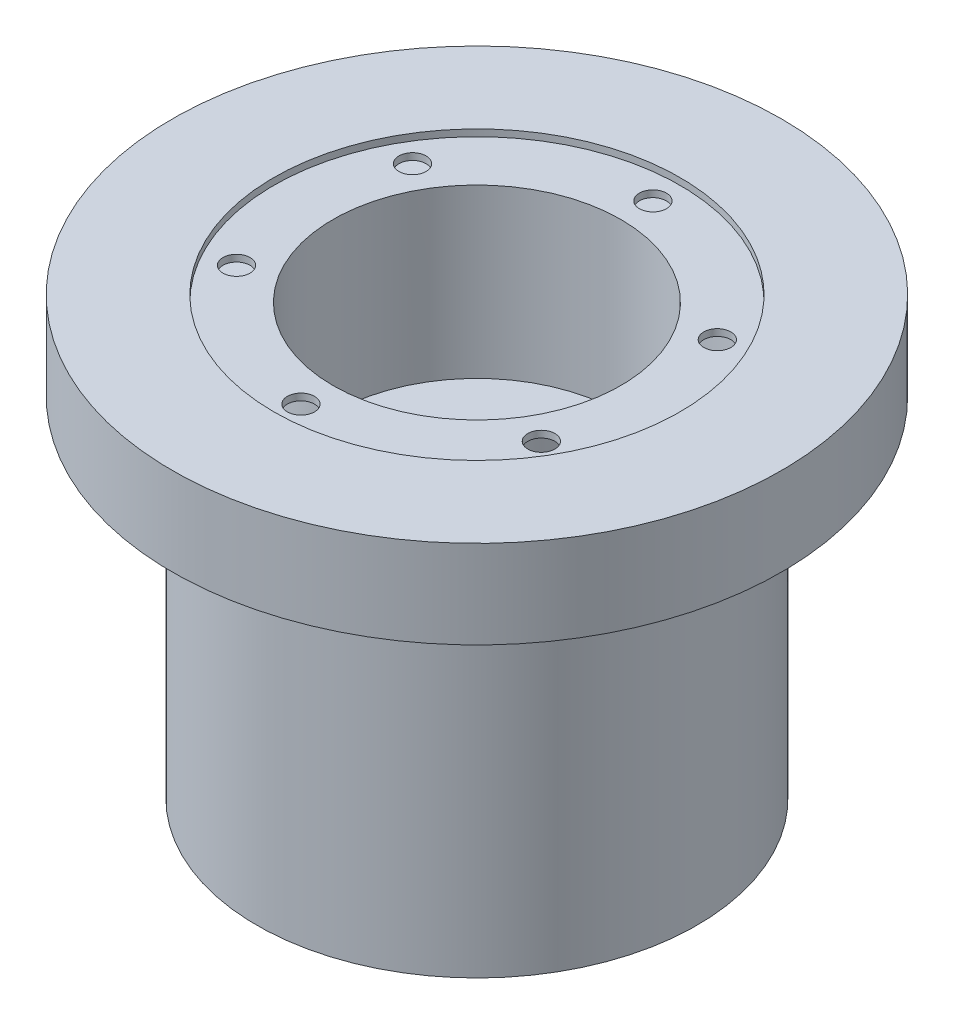
ISO-10303-21;
HEADER;
FILE_DESCRIPTION(('STEP AP214'),'2;1');
FILE_NAME('part.step','',(''),(''),'','','');
FILE_SCHEMA(('AUTOMOTIVE_DESIGN { 1 0 10303 214 1 1 1 1 }'));
ENDSEC;
DATA;
#1=APPLICATION_CONTEXT('core data for automotive mechanical design processes');
#2=APPLICATION_PROTOCOL_DEFINITION('international standard','automotive_design',2000,#1);
#3=PRODUCT_CONTEXT('',#1,'mechanical');
#4=PRODUCT('Part','Part','',(#3));
#5=PRODUCT_RELATED_PRODUCT_CATEGORY('part','',(#4));
#6=PRODUCT_DEFINITION_FORMATION('','',#4);
#7=PRODUCT_DEFINITION_CONTEXT('part definition',#1,'design');
#8=PRODUCT_DEFINITION('design','',#6,#7);
#9=PRODUCT_DEFINITION_SHAPE('','',#8);
#10=(LENGTH_UNIT() NAMED_UNIT(*) SI_UNIT(.MILLI.,.METRE.));
#11=(NAMED_UNIT(*) PLANE_ANGLE_UNIT() SI_UNIT($,.RADIAN.));
#12=(NAMED_UNIT(*) SI_UNIT($,.STERADIAN.) SOLID_ANGLE_UNIT());
#13=UNCERTAINTY_MEASURE_WITH_UNIT(LENGTH_MEASURE(1.E-05),#10,'distance_accuracy_value','');
#14=(GEOMETRIC_REPRESENTATION_CONTEXT(3) GLOBAL_UNCERTAINTY_ASSIGNED_CONTEXT((#13)) GLOBAL_UNIT_ASSIGNED_CONTEXT((#10,
#11,#12)) REPRESENTATION_CONTEXT('',''));
#15=CARTESIAN_POINT('',(0.,0.,0.));
#16=DIRECTION('',(0.,0.,1.));
#17=DIRECTION('',(1.,0.,0.));
#18=AXIS2_PLACEMENT_3D('',#15,#16,#17);
#19=CARTESIAN_POINT('',(0.,23.8395232070911,0.));
#20=DIRECTION('',(0.,1.,0.));
#21=DIRECTION('',(0.,0.,1.));
#22=AXIS2_PLACEMENT_3D('',#19,#20,#21);
#23=PLANE('',#22);
#24=CARTESIAN_POINT('',(14.769356871362,23.8395232070911,-26.));
#25=DIRECTION('',(0.,1.,0.));
#26=DIRECTION('',(0.,0.,1.));
#27=AXIS2_PLACEMENT_3D('',#24,#25,#26);
#28=CIRCLE('',#27,2.);
#29=CARTESIAN_POINT('',(14.769356871362,23.8395232070911,-24.));
#30=VERTEX_POINT('',#29);
#31=EDGE_CURVE('E37',#30,#30,#28,.T.);
#32=ORIENTED_EDGE('',*,*,#31,.T.);
#33=EDGE_LOOP('',(#32));
#34=FACE_BOUND('',#33,.T.);
#35=CARTESIAN_POINT('',(37.2860173697574,23.8395232070911,-13.));
#36=DIRECTION('',(0.,1.,0.));
#37=DIRECTION('',(0.,0.,1.));
#38=AXIS2_PLACEMENT_3D('',#35,#36,#37);
#39=CIRCLE('',#38,2.00000000000002);
#40=CARTESIAN_POINT('',(37.2860173697574,23.8395232070911,-11.));
#41=VERTEX_POINT('',#40);
#42=EDGE_CURVE('E70',#41,#41,#39,.T.);
#43=ORIENTED_EDGE('',*,*,#42,.T.);
#44=EDGE_LOOP('',(#43));
#45=FACE_BOUND('',#44,.T.);
#46=CARTESIAN_POINT('',(37.2860173697574,23.8395232070911,13.));
#47=DIRECTION('',(0.,1.,0.));
#48=DIRECTION('',(0.,0.,1.));
#49=AXIS2_PLACEMENT_3D('',#46,#47,#48);
#50=CIRCLE('',#49,2.);
#51=CARTESIAN_POINT('',(37.2860173697574,23.8395232070911,15.));
#52=VERTEX_POINT('',#51);
#53=EDGE_CURVE('E67',#52,#52,#50,.T.);
#54=ORIENTED_EDGE('',*,*,#53,.T.);
#55=EDGE_LOOP('',(#54));
#56=FACE_BOUND('',#55,.T.);
#57=CARTESIAN_POINT('',(14.769356871362,23.8395232070911,26.));
#58=DIRECTION('',(0.,1.,0.));
#59=DIRECTION('',(0.,0.,1.));
#60=AXIS2_PLACEMENT_3D('',#57,#58,#59);
#61=CIRCLE('',#60,2.00000000000001);
#62=CARTESIAN_POINT('',(14.769356871362,23.8395232070911,28.));
#63=VERTEX_POINT('',#62);
#64=EDGE_CURVE('E63',#63,#63,#61,.T.);
#65=ORIENTED_EDGE('',*,*,#64,.T.);
#66=EDGE_LOOP('',(#65));
#67=FACE_BOUND('',#66,.T.);
#68=CARTESIAN_POINT('',(-7.74730362703343,23.8395232070911,13.));
#69=DIRECTION('',(0.,1.,0.));
#70=DIRECTION('',(0.,0.,1.));
#71=AXIS2_PLACEMENT_3D('',#68,#69,#70);
#72=CIRCLE('',#71,2.);
#73=CARTESIAN_POINT('',(-7.74730362703343,23.8395232070911,15.));
#74=VERTEX_POINT('',#73);
#75=EDGE_CURVE('E59',#74,#74,#72,.T.);
#76=ORIENTED_EDGE('',*,*,#75,.T.);
#77=EDGE_LOOP('',(#76));
#78=FACE_BOUND('',#77,.T.);
#79=CARTESIAN_POINT('',(-7.74730362703344,23.8395232070911,-13.));
#80=DIRECTION('',(0.,1.,0.));
#81=DIRECTION('',(0.,0.,1.));
#82=AXIS2_PLACEMENT_3D('',#79,#80,#81);
#83=CIRCLE('',#82,2.00000000000001);
#84=CARTESIAN_POINT('',(-7.74730362703344,23.8395232070911,-11.));
#85=VERTEX_POINT('',#84);
#86=EDGE_CURVE('E55',#85,#85,#83,.T.);
#87=ORIENTED_EDGE('',*,*,#86,.T.);
#88=EDGE_LOOP('',(#87));
#89=FACE_BOUND('',#88,.T.);
#90=CARTESIAN_POINT('',(14.769356871362,23.8395232070911,0.));
#91=DIRECTION('',(0.,-1.,0.));
#92=DIRECTION('',(0.,0.,-1.));
#93=AXIS2_PLACEMENT_3D('',#90,#91,#92);
#94=CIRCLE('',#93,23.2642786667147);
#95=CARTESIAN_POINT('',(14.769356871362,23.8395232070911,-23.2642786667147));
#96=VERTEX_POINT('',#95);
#97=EDGE_CURVE('E53',#96,#96,#94,.T.);
#98=ORIENTED_EDGE('',*,*,#97,.F.);
#99=EDGE_LOOP('',(#98));
#100=FACE_BOUND('',#99,.T.);
#101=CARTESIAN_POINT('',(14.769356871362,23.8395232070911,0.));
#102=DIRECTION('',(0.,-1.,0.));
#103=DIRECTION('',(0.,0.,-1.));
#104=AXIS2_PLACEMENT_3D('',#101,#102,#103);
#105=CIRCLE('',#104,43.);
#106=CARTESIAN_POINT('',(14.769356871362,23.8395232070911,-43.));
#107=VERTEX_POINT('',#106);
#108=EDGE_CURVE('E124',#107,#107,#105,.T.);
#109=ORIENTED_EDGE('',*,*,#108,.T.);
#110=EDGE_LOOP('',(#109));
#111=FACE_BOUND('',#110,.T.);
#112=ADVANCED_FACE('F33',(#34,#45,#56,#67,#78,#89,#100,#111),#23,.F.);
#113=CARTESIAN_POINT('',(14.769356871362,-26.2561347359243,0.));
#114=DIRECTION('',(0.,-1.,0.));
#115=DIRECTION('',(0.,0.,-1.));
#116=AXIS2_PLACEMENT_3D('',#113,#114,#115);
#117=CYLINDRICAL_SURFACE('',#116,43.);
#118=CARTESIAN_POINT('',(14.769356871362,14.8395232070911,0.));
#119=DIRECTION('',(0.,-1.,0.));
#120=DIRECTION('',(0.,0.,-1.));
#121=AXIS2_PLACEMENT_3D('',#118,#119,#120);
#122=CIRCLE('',#121,43.);
#123=CARTESIAN_POINT('',(14.769356871362,14.8395232070911,-43.));
#124=VERTEX_POINT('',#123);
#125=EDGE_CURVE('E121',#124,#124,#122,.T.);
#126=ORIENTED_EDGE('',*,*,#125,.T.);
#127=EDGE_LOOP('',(#126));
#128=FACE_BOUND('',#127,.T.);
#129=ORIENTED_EDGE('',*,*,#108,.F.);
#130=EDGE_LOOP('',(#129));
#131=FACE_BOUND('',#130,.T.);
#132=ADVANCED_FACE('F169',(#128,#131),#117,.F.);
#133=CARTESIAN_POINT('',(0.,14.8395232070911,0.));
#134=DIRECTION('',(0.,-1.,0.));
#135=DIRECTION('',(0.,0.,-1.));
#136=AXIS2_PLACEMENT_3D('',#133,#134,#135);
#137=PLANE('',#136);
#138=ORIENTED_EDGE('',*,*,#125,.F.);
#139=EDGE_LOOP('',(#138));
#140=FACE_BOUND('',#139,.T.);
#141=CARTESIAN_POINT('',(14.769356871362,14.8395232070911,0.));
#142=DIRECTION('',(0.,-1.,0.));
#143=DIRECTION('',(0.,0.,-1.));
#144=AXIS2_PLACEMENT_3D('',#141,#142,#143);
#145=CIRCLE('',#144,30.5);
#146=CARTESIAN_POINT('',(14.769356871362,14.8395232070911,-30.5));
#147=VERTEX_POINT('',#146);
#148=EDGE_CURVE('E118',#147,#147,#145,.T.);
#149=ORIENTED_EDGE('',*,*,#148,.T.);
#150=EDGE_LOOP('',(#149));
#151=FACE_BOUND('',#150,.T.);
#152=ADVANCED_FACE('F175',(#140,#151),#137,.F.);
#153=CARTESIAN_POINT('',(14.769356871362,-26.2561347359243,0.));
#154=DIRECTION('',(0.,-1.,0.));
#155=DIRECTION('',(0.,0.,-1.));
#156=AXIS2_PLACEMENT_3D('',#153,#154,#155);
#157=CYLINDRICAL_SURFACE('',#156,30.5);
#158=ORIENTED_EDGE('',*,*,#148,.F.);
#159=EDGE_LOOP('',(#158));
#160=FACE_BOUND('',#159,.T.);
#161=CARTESIAN_POINT('',(14.769356871362,-36.6100857282168,0.));
#162=DIRECTION('',(0.,-1.,0.));
#163=DIRECTION('',(0.,0.,-1.));
#164=AXIS2_PLACEMENT_3D('',#161,#162,#163);
#165=CIRCLE('',#164,30.5);
#166=CARTESIAN_POINT('',(14.769356871362,-36.6100857282168,-30.5));
#167=VERTEX_POINT('',#166);
#168=EDGE_CURVE('E115',#167,#167,#165,.T.);
#169=ORIENTED_EDGE('',*,*,#168,.T.);
#170=EDGE_LOOP('',(#169));
#171=FACE_BOUND('',#170,.T.);
#172=ADVANCED_FACE('F457',(#160,#171),#157,.F.);
#173=CARTESIAN_POINT('',(0.,-36.6100857282168,0.));
#174=DIRECTION('',(0.,-1.,0.));
#175=DIRECTION('',(0.,0.,-1.));
#176=AXIS2_PLACEMENT_3D('',#173,#174,#175);
#177=PLANE('',#176);
#178=ORIENTED_EDGE('',*,*,#168,.F.);
#179=EDGE_LOOP('',(#178));
#180=FACE_BOUND('',#179,.T.);
#181=CARTESIAN_POINT('',(14.769356871362,-36.6100857282168,0.));
#182=DIRECTION('',(0.,-1.,0.));
#183=DIRECTION('',(0.,0.,-1.));
#184=AXIS2_PLACEMENT_3D('',#181,#182,#183);
#185=CIRCLE('',#184,22.5);
#186=CARTESIAN_POINT('',(14.769356871362,-36.6100857282168,-22.5));
#187=VERTEX_POINT('',#186);
#188=EDGE_CURVE('E112',#187,#187,#185,.T.);
#189=ORIENTED_EDGE('',*,*,#188,.T.);
#190=EDGE_LOOP('',(#189));
#191=FACE_BOUND('',#190,.T.);
#192=ADVANCED_FACE('F446',(#180,#191),#177,.F.);
#193=CARTESIAN_POINT('',(14.769356871362,-26.2561347359243,0.));
#194=DIRECTION('',(0.,-1.,0.));
#195=DIRECTION('',(0.,0.,-1.));
#196=AXIS2_PLACEMENT_3D('',#193,#194,#195);
#197=CYLINDRICAL_SURFACE('',#196,22.5);
#198=ORIENTED_EDGE('',*,*,#188,.F.);
#199=EDGE_LOOP('',(#198));
#200=FACE_BOUND('',#199,.T.);
#201=CARTESIAN_POINT('',(14.769356871362,-21.8867005858943,0.));
#202=DIRECTION('',(0.,-1.,0.));
#203=DIRECTION('',(0.,0.,-1.));
#204=AXIS2_PLACEMENT_3D('',#201,#202,#203);
#205=CIRCLE('',#204,22.5);
#206=CARTESIAN_POINT('',(14.769356871362,-21.8867005858943,-22.5));
#207=VERTEX_POINT('',#206);
#208=EDGE_CURVE('E109',#207,#207,#205,.T.);
#209=ORIENTED_EDGE('',*,*,#208,.T.);
#210=EDGE_LOOP('',(#209));
#211=FACE_BOUND('',#210,.T.);
#212=ADVANCED_FACE('F436',(#200,#211),#197,.T.);
#213=CARTESIAN_POINT('',(0.,-21.8867005858943,0.));
#214=DIRECTION('',(0.,1.,0.));
#215=DIRECTION('',(0.,0.,1.));
#216=AXIS2_PLACEMENT_3D('',#213,#214,#215);
#217=PLANE('',#216);
#218=CARTESIAN_POINT('',(14.769356871362,-21.8867005858943,0.));
#219=DIRECTION('',(0.,-1.,0.));
#220=DIRECTION('',(0.,0.,-1.));
#221=AXIS2_PLACEMENT_3D('',#218,#219,#220);
#222=CIRCLE('',#221,19.5);
#223=CARTESIAN_POINT('',(14.769356871362,-21.8867005858943,-19.5));
#224=VERTEX_POINT('',#223);
#225=EDGE_CURVE('E106',#224,#224,#222,.T.);
#226=ORIENTED_EDGE('',*,*,#225,.T.);
#227=EDGE_LOOP('',(#226));
#228=FACE_BOUND('',#227,.T.);
#229=ORIENTED_EDGE('',*,*,#208,.F.);
#230=EDGE_LOOP('',(#229));
#231=FACE_BOUND('',#230,.T.);
#232=ADVANCED_FACE('F426',(#228,#231),#217,.T.);
#233=CARTESIAN_POINT('',(14.769356871362,-26.2561347359243,0.));
#234=DIRECTION('',(0.,-1.,0.));
#235=DIRECTION('',(0.,0.,-1.));
#236=AXIS2_PLACEMENT_3D('',#233,#234,#235);
#237=CYLINDRICAL_SURFACE('',#236,19.5);
#238=CARTESIAN_POINT('',(14.769356871362,-20.3867005858943,0.));
#239=DIRECTION('',(0.,-1.,0.));
#240=DIRECTION('',(0.,0.,-1.));
#241=AXIS2_PLACEMENT_3D('',#238,#239,#240);
#242=CIRCLE('',#241,19.5);
#243=CARTESIAN_POINT('',(14.769356871362,-20.3867005858943,-19.5));
#244=VERTEX_POINT('',#243);
#245=EDGE_CURVE('E103',#244,#244,#242,.T.);
#246=ORIENTED_EDGE('',*,*,#245,.T.);
#247=EDGE_LOOP('',(#246));
#248=FACE_BOUND('',#247,.T.);
#249=ORIENTED_EDGE('',*,*,#225,.F.);
#250=EDGE_LOOP('',(#249));
#251=FACE_BOUND('',#250,.T.);
#252=ADVANCED_FACE('F416',(#248,#251),#237,.T.);
#253=CARTESIAN_POINT('',(14.769356871362,-20.3867005858943,0.));
#254=DIRECTION('',(0.,-1.,0.));
#255=DIRECTION('',(0.,0.,-1.));
#256=AXIS2_PLACEMENT_3D('',#253,#254,#255);
#257=CONICAL_SURFACE('',#256,19.5,0.244469073533823);
#258=CARTESIAN_POINT('',(14.769356871362,-3.40704614928249,0.));
#259=DIRECTION('',(0.,-1.,0.));
#260=DIRECTION('',(0.,0.,-1.));
#261=AXIS2_PLACEMENT_3D('',#258,#259,#260);
#262=CIRCLE('',#261,15.2642786667147);
#263=CARTESIAN_POINT('',(14.769356871362,-3.40704614928249,-15.2642786667147));
#264=VERTEX_POINT('',#263);
#265=EDGE_CURVE('E100',#264,#264,#262,.T.);
#266=ORIENTED_EDGE('',*,*,#265,.T.);
#267=EDGE_LOOP('',(#266));
#268=FACE_BOUND('',#267,.T.);
#269=ORIENTED_EDGE('',*,*,#245,.F.);
#270=EDGE_LOOP('',(#269));
#271=FACE_BOUND('',#270,.T.);
#272=ADVANCED_FACE('F406',(#268,#271),#257,.T.);
#273=CARTESIAN_POINT('',(14.769356871362,-26.2561347359243,0.));
#274=DIRECTION('',(0.,-1.,0.));
#275=DIRECTION('',(0.,0.,-1.));
#276=AXIS2_PLACEMENT_3D('',#273,#274,#275);
#277=CYLINDRICAL_SURFACE('',#276,15.2642786667147);
#278=CARTESIAN_POINT('',(14.769356871362,-1.90704614928248,0.));
#279=DIRECTION('',(0.,-1.,0.));
#280=DIRECTION('',(0.,0.,-1.));
#281=AXIS2_PLACEMENT_3D('',#278,#279,#280);
#282=CIRCLE('',#281,15.2642786667147);
#283=CARTESIAN_POINT('',(14.769356871362,-1.90704614928248,-15.2642786667147));
#284=VERTEX_POINT('',#283);
#285=EDGE_CURVE('E97',#284,#284,#282,.T.);
#286=ORIENTED_EDGE('',*,*,#285,.T.);
#287=EDGE_LOOP('',(#286));
#288=FACE_BOUND('',#287,.T.);
#289=ORIENTED_EDGE('',*,*,#265,.F.);
#290=EDGE_LOOP('',(#289));
#291=FACE_BOUND('',#290,.T.);
#292=ADVANCED_FACE('F396',(#288,#291),#277,.T.);
#293=CARTESIAN_POINT('',(0.,-1.90704614928248,0.));
#294=DIRECTION('',(0.,-1.,0.));
#295=DIRECTION('',(0.,0.,-1.));
#296=AXIS2_PLACEMENT_3D('',#293,#294,#295);
#297=PLANE('',#296);
#298=CARTESIAN_POINT('',(14.769356871362,-1.90704614928248,0.));
#299=DIRECTION('',(0.,-1.,0.));
#300=DIRECTION('',(0.,0.,-1.));
#301=AXIS2_PLACEMENT_3D('',#298,#299,#300);
#302=CIRCLE('',#301,23.2642786667147);
#303=CARTESIAN_POINT('',(14.769356871362,-1.90704614928248,-23.2642786667147));
#304=VERTEX_POINT('',#303);
#305=EDGE_CURVE('E94',#304,#304,#302,.T.);
#306=ORIENTED_EDGE('',*,*,#305,.T.);
#307=EDGE_LOOP('',(#306));
#308=FACE_BOUND('',#307,.T.);
#309=ORIENTED_EDGE('',*,*,#285,.F.);
#310=EDGE_LOOP('',(#309));
#311=FACE_BOUND('',#310,.T.);
#312=ADVANCED_FACE('F385',(#308,#311),#297,.T.);
#313=CARTESIAN_POINT('',(14.769356871362,-26.2561347359243,0.));
#314=DIRECTION('',(0.,-1.,0.));
#315=DIRECTION('',(0.,0.,-1.));
#316=AXIS2_PLACEMENT_3D('',#313,#314,#315);
#317=CYLINDRICAL_SURFACE('',#316,23.2642786667147);
#318=ORIENTED_EDGE('',*,*,#97,.T.);
#319=EDGE_LOOP('',(#318));
#320=FACE_BOUND('',#319,.T.);
#321=ORIENTED_EDGE('',*,*,#305,.F.);
#322=EDGE_LOOP('',(#321));
#323=FACE_BOUND('',#322,.T.);
#324=ADVANCED_FACE('F285',(#320,#323),#317,.T.);
#325=CARTESIAN_POINT('',(-7.74730362703344,19.8395232070911,-13.));
#326=DIRECTION('',(0.,1.,0.));
#327=DIRECTION('',(0.,0.,1.));
#328=AXIS2_PLACEMENT_3D('',#325,#326,#327);
#329=CYLINDRICAL_SURFACE('',#328,2.00000000000001);
#330=CARTESIAN_POINT('',(-7.74730362703344,24.8395232070911,-13.));
#331=DIRECTION('',(0.,1.,0.));
#332=DIRECTION('',(0.,0.,1.));
#333=AXIS2_PLACEMENT_3D('',#330,#331,#332);
#334=CIRCLE('',#333,2.00000000000001);
#335=CARTESIAN_POINT('',(-7.74730362703344,24.8395232070911,-11.));
#336=VERTEX_POINT('',#335);
#337=EDGE_CURVE('E58',#336,#336,#334,.T.);
#338=ORIENTED_EDGE('',*,*,#337,.T.);
#339=EDGE_LOOP('',(#338));
#340=FACE_BOUND('',#339,.T.);
#341=ORIENTED_EDGE('',*,*,#86,.F.);
#342=EDGE_LOOP('',(#341));
#343=FACE_BOUND('',#342,.T.);
#344=ADVANCED_FACE('F280',(#340,#343),#329,.F.);
#345=CARTESIAN_POINT('',(-7.74730362703343,19.8395232070911,13.));
#346=DIRECTION('',(0.,1.,0.));
#347=DIRECTION('',(0.,0.,1.));
#348=AXIS2_PLACEMENT_3D('',#345,#346,#347);
#349=CYLINDRICAL_SURFACE('',#348,2.);
#350=CARTESIAN_POINT('',(-7.74730362703343,24.8395232070911,13.));
#351=DIRECTION('',(0.,1.,0.));
#352=DIRECTION('',(0.,0.,1.));
#353=AXIS2_PLACEMENT_3D('',#350,#351,#352);
#354=CIRCLE('',#353,2.);
#355=CARTESIAN_POINT('',(-7.74730362703343,24.8395232070911,15.));
#356=VERTEX_POINT('',#355);
#357=EDGE_CURVE('E62',#356,#356,#354,.T.);
#358=ORIENTED_EDGE('',*,*,#357,.T.);
#359=EDGE_LOOP('',(#358));
#360=FACE_BOUND('',#359,.T.);
#361=ORIENTED_EDGE('',*,*,#75,.F.);
#362=EDGE_LOOP('',(#361));
#363=FACE_BOUND('',#362,.T.);
#364=ADVANCED_FACE('F284',(#360,#363),#349,.F.);
#365=CARTESIAN_POINT('',(14.769356871362,19.8395232070911,26.));
#366=DIRECTION('',(0.,1.,0.));
#367=DIRECTION('',(0.,0.,1.));
#368=AXIS2_PLACEMENT_3D('',#365,#366,#367);
#369=CYLINDRICAL_SURFACE('',#368,2.00000000000001);
#370=CARTESIAN_POINT('',(14.769356871362,24.8395232070911,26.));
#371=DIRECTION('',(0.,1.,0.));
#372=DIRECTION('',(0.,0.,1.));
#373=AXIS2_PLACEMENT_3D('',#370,#371,#372);
#374=CIRCLE('',#373,2.00000000000001);
#375=CARTESIAN_POINT('',(14.769356871362,24.8395232070911,28.));
#376=VERTEX_POINT('',#375);
#377=EDGE_CURVE('E66',#376,#376,#374,.T.);
#378=ORIENTED_EDGE('',*,*,#377,.T.);
#379=EDGE_LOOP('',(#378));
#380=FACE_BOUND('',#379,.T.);
#381=ORIENTED_EDGE('',*,*,#64,.F.);
#382=EDGE_LOOP('',(#381));
#383=FACE_BOUND('',#382,.T.);
#384=ADVANCED_FACE('F296',(#380,#383),#369,.F.);
#385=CARTESIAN_POINT('',(37.2860173697574,19.8395232070911,13.));
#386=DIRECTION('',(0.,1.,0.));
#387=DIRECTION('',(0.,0.,1.));
#388=AXIS2_PLACEMENT_3D('',#385,#386,#387);
#389=CYLINDRICAL_SURFACE('',#388,2.);
#390=CARTESIAN_POINT('',(37.2860173697574,24.8395232070911,13.));
#391=DIRECTION('',(0.,1.,0.));
#392=DIRECTION('',(0.,0.,1.));
#393=AXIS2_PLACEMENT_3D('',#390,#391,#392);
#394=CIRCLE('',#393,2.);
#395=CARTESIAN_POINT('',(37.2860173697574,24.8395232070911,15.));
#396=VERTEX_POINT('',#395);
#397=EDGE_CURVE('E69',#396,#396,#394,.T.);
#398=ORIENTED_EDGE('',*,*,#397,.T.);
#399=EDGE_LOOP('',(#398));
#400=FACE_BOUND('',#399,.T.);
#401=ORIENTED_EDGE('',*,*,#53,.F.);
#402=EDGE_LOOP('',(#401));
#403=FACE_BOUND('',#402,.T.);
#404=ADVANCED_FACE('F306',(#400,#403),#389,.F.);
#405=CARTESIAN_POINT('',(37.2860173697574,19.8395232070911,-13.));
#406=DIRECTION('',(0.,1.,0.));
#407=DIRECTION('',(0.,0.,1.));
#408=AXIS2_PLACEMENT_3D('',#405,#406,#407);
#409=CYLINDRICAL_SURFACE('',#408,2.00000000000002);
#410=CARTESIAN_POINT('',(37.2860173697574,24.8395232070911,-13.));
#411=DIRECTION('',(0.,1.,0.));
#412=DIRECTION('',(0.,0.,1.));
#413=AXIS2_PLACEMENT_3D('',#410,#411,#412);
#414=CIRCLE('',#413,2.00000000000002);
#415=CARTESIAN_POINT('',(37.2860173697574,24.8395232070911,-11.));
#416=VERTEX_POINT('',#415);
#417=EDGE_CURVE('E72',#416,#416,#414,.T.);
#418=ORIENTED_EDGE('',*,*,#417,.T.);
#419=EDGE_LOOP('',(#418));
#420=FACE_BOUND('',#419,.T.);
#421=ORIENTED_EDGE('',*,*,#42,.F.);
#422=EDGE_LOOP('',(#421));
#423=FACE_BOUND('',#422,.T.);
#424=ADVANCED_FACE('F316',(#420,#423),#409,.F.);
#425=CARTESIAN_POINT('',(14.769356871362,19.8395232070911,-26.));
#426=DIRECTION('',(0.,1.,0.));
#427=DIRECTION('',(0.,0.,1.));
#428=AXIS2_PLACEMENT_3D('',#425,#426,#427);
#429=CYLINDRICAL_SURFACE('',#428,2.);
#430=CARTESIAN_POINT('',(14.769356871362,24.8395232070911,-26.));
#431=DIRECTION('',(0.,1.,0.));
#432=DIRECTION('',(0.,0.,1.));
#433=AXIS2_PLACEMENT_3D('',#430,#431,#432);
#434=CIRCLE('',#433,2.);
#435=CARTESIAN_POINT('',(14.769356871362,24.8395232070911,-24.));
#436=VERTEX_POINT('',#435);
#437=EDGE_CURVE('E84',#436,#436,#434,.T.);
#438=ORIENTED_EDGE('',*,*,#437,.T.);
#439=EDGE_LOOP('',(#438));
#440=FACE_BOUND('',#439,.T.);
#441=ORIENTED_EDGE('',*,*,#31,.F.);
#442=EDGE_LOOP('',(#441));
#443=FACE_BOUND('',#442,.T.);
#444=ADVANCED_FACE('F184',(#440,#443),#429,.F.);
#445=CARTESIAN_POINT('',(14.769356871362,-26.2561347359243,0.));
#446=DIRECTION('',(0.,-1.,0.));
#447=DIRECTION('',(0.,0.,-1.));
#448=AXIS2_PLACEMENT_3D('',#445,#446,#447);
#449=CYLINDRICAL_SURFACE('',#448,21.2642786667147);
#450=CARTESIAN_POINT('',(14.769356871362,0.0929538507175205,0.));
#451=DIRECTION('',(0.,-1.,0.));
#452=DIRECTION('',(0.,0.,-1.));
#453=AXIS2_PLACEMENT_3D('',#450,#451,#452);
#454=CIRCLE('',#453,21.2642786667147);
#455=CARTESIAN_POINT('',(14.769356871362,0.0929538507175205,-21.2642786667147));
#456=VERTEX_POINT('',#455);
#457=EDGE_CURVE('E127',#456,#456,#454,.T.);
#458=ORIENTED_EDGE('',*,*,#457,.T.);
#459=EDGE_LOOP('',(#458));
#460=FACE_BOUND('',#459,.T.);
#461=CARTESIAN_POINT('',(14.769356871362,24.8395232070911,0.));
#462=DIRECTION('',(0.,1.,0.));
#463=DIRECTION('',(0.,0.,1.));
#464=AXIS2_PLACEMENT_3D('',#461,#462,#463);
#465=CIRCLE('',#464,21.2642786667147);
#466=CARTESIAN_POINT('',(14.769356871362,24.8395232070911,21.2642786667147));
#467=VERTEX_POINT('',#466);
#468=EDGE_CURVE('E50',#467,#467,#465,.F.);
#469=ORIENTED_EDGE('',*,*,#468,.F.);
#470=EDGE_LOOP('',(#469));
#471=FACE_BOUND('',#470,.T.);
#472=ADVANCED_FACE('F181',(#460,#471),#449,.F.);
#473=CARTESIAN_POINT('',(0.,25.8395232070911,0.));
#474=DIRECTION('',(0.,1.,0.));
#475=DIRECTION('',(0.,0.,1.));
#476=AXIS2_PLACEMENT_3D('',#473,#474,#475);
#477=PLANE('',#476);
#478=CARTESIAN_POINT('',(14.769356871362,25.8395232070911,0.));
#479=DIRECTION('',(0.,1.,0.));
#480=DIRECTION('',(0.,0.,1.));
#481=AXIS2_PLACEMENT_3D('',#478,#479,#480);
#482=CIRCLE('',#481,30.);
#483=CARTESIAN_POINT('',(14.769356871362,25.8395232070911,30.));
#484=VERTEX_POINT('',#483);
#485=EDGE_CURVE('E87',#484,#484,#482,.T.);
#486=ORIENTED_EDGE('',*,*,#485,.F.);
#487=EDGE_LOOP('',(#486));
#488=FACE_BOUND('',#487,.T.);
#489=CARTESIAN_POINT('',(14.769356871362,25.8395232070911,0.));
#490=DIRECTION('',(0.,-1.,0.));
#491=DIRECTION('',(0.,0.,-1.));
#492=AXIS2_PLACEMENT_3D('',#489,#490,#491);
#493=CIRCLE('',#492,45.);
#494=CARTESIAN_POINT('',(14.769356871362,25.8395232070911,-45.));
#495=VERTEX_POINT('',#494);
#496=EDGE_CURVE('E10',#495,#495,#493,.T.);
#497=ORIENTED_EDGE('',*,*,#496,.F.);
#498=EDGE_LOOP('',(#497));
#499=FACE_BOUND('',#498,.T.);
#500=ADVANCED_FACE('F35',(#488,#499),#477,.T.);
#501=CARTESIAN_POINT('',(14.769356871362,-26.2561347359243,0.));
#502=DIRECTION('',(0.,-1.,0.));
#503=DIRECTION('',(0.,0.,-1.));
#504=AXIS2_PLACEMENT_3D('',#501,#502,#503);
#505=CYLINDRICAL_SURFACE('',#504,45.);
#506=CARTESIAN_POINT('',(14.769356871362,12.8395232070911,0.));
#507=DIRECTION('',(0.,-1.,0.));
#508=DIRECTION('',(0.,0.,-1.));
#509=AXIS2_PLACEMENT_3D('',#506,#507,#508);
#510=CIRCLE('',#509,45.);
#511=CARTESIAN_POINT('',(14.769356871362,12.8395232070911,-45.));
#512=VERTEX_POINT('',#511);
#513=EDGE_CURVE('E41',#512,#512,#510,.T.);
#514=ORIENTED_EDGE('',*,*,#513,.F.);
#515=EDGE_LOOP('',(#514));
#516=FACE_BOUND('',#515,.T.);
#517=ORIENTED_EDGE('',*,*,#496,.T.);
#518=EDGE_LOOP('',(#517));
#519=FACE_BOUND('',#518,.T.);
#520=ADVANCED_FACE('F158',(#516,#519),#505,.T.);
#521=CARTESIAN_POINT('',(0.,12.8395232070911,0.));
#522=DIRECTION('',(0.,-1.,0.));
#523=DIRECTION('',(0.,0.,-1.));
#524=AXIS2_PLACEMENT_3D('',#521,#522,#523);
#525=PLANE('',#524);
#526=ORIENTED_EDGE('',*,*,#513,.T.);
#527=EDGE_LOOP('',(#526));
#528=FACE_BOUND('',#527,.T.);
#529=CARTESIAN_POINT('',(14.769356871362,12.8395232070911,0.));
#530=DIRECTION('',(0.,-1.,0.));
#531=DIRECTION('',(0.,0.,-1.));
#532=AXIS2_PLACEMENT_3D('',#529,#530,#531);
#533=CIRCLE('',#532,32.5);
#534=CARTESIAN_POINT('',(14.769356871362,12.8395232070911,-32.5));
#535=VERTEX_POINT('',#534);
#536=EDGE_CURVE('E46',#535,#535,#533,.T.);
#537=ORIENTED_EDGE('',*,*,#536,.F.);
#538=EDGE_LOOP('',(#537));
#539=FACE_BOUND('',#538,.T.);
#540=ADVANCED_FACE('F156',(#528,#539),#525,.T.);
#541=CARTESIAN_POINT('',(14.769356871362,-26.2561347359243,0.));
#542=DIRECTION('',(0.,-1.,0.));
#543=DIRECTION('',(0.,0.,-1.));
#544=AXIS2_PLACEMENT_3D('',#541,#542,#543);
#545=CYLINDRICAL_SURFACE('',#544,32.5);
#546=ORIENTED_EDGE('',*,*,#536,.T.);
#547=EDGE_LOOP('',(#546));
#548=FACE_BOUND('',#547,.T.);
#549=CARTESIAN_POINT('',(14.769356871362,-38.6100857282168,0.));
#550=DIRECTION('',(0.,-1.,0.));
#551=DIRECTION('',(0.,0.,-1.));
#552=AXIS2_PLACEMENT_3D('',#549,#550,#551);
#553=CIRCLE('',#552,32.5);
#554=CARTESIAN_POINT('',(14.769356871362,-38.6100857282168,-32.5));
#555=VERTEX_POINT('',#554);
#556=EDGE_CURVE('E148',#555,#555,#553,.T.);
#557=ORIENTED_EDGE('',*,*,#556,.F.);
#558=EDGE_LOOP('',(#557));
#559=FACE_BOUND('',#558,.T.);
#560=ADVANCED_FACE('F153',(#548,#559),#545,.T.);
#561=CARTESIAN_POINT('',(0.,-38.6100857282168,0.));
#562=DIRECTION('',(0.,-1.,0.));
#563=DIRECTION('',(0.,0.,-1.));
#564=AXIS2_PLACEMENT_3D('',#561,#562,#563);
#565=PLANE('',#564);
#566=ORIENTED_EDGE('',*,*,#556,.T.);
#567=EDGE_LOOP('',(#566));
#568=FACE_BOUND('',#567,.T.);
#569=CARTESIAN_POINT('',(14.769356871362,-38.6100857282168,0.));
#570=DIRECTION('',(0.,-1.,0.));
#571=DIRECTION('',(0.,0.,-1.));
#572=AXIS2_PLACEMENT_3D('',#569,#570,#571);
#573=CIRCLE('',#572,20.5);
#574=CARTESIAN_POINT('',(14.769356871362,-38.6100857282168,-20.5));
#575=VERTEX_POINT('',#574);
#576=EDGE_CURVE('E145',#575,#575,#573,.T.);
#577=ORIENTED_EDGE('',*,*,#576,.F.);
#578=EDGE_LOOP('',(#577));
#579=FACE_BOUND('',#578,.T.);
#580=ADVANCED_FACE('F165',(#568,#579),#565,.T.);
#581=CARTESIAN_POINT('',(14.769356871362,-26.2561347359243,0.));
#582=DIRECTION('',(0.,-1.,0.));
#583=DIRECTION('',(0.,0.,-1.));
#584=AXIS2_PLACEMENT_3D('',#581,#582,#583);
#585=CYLINDRICAL_SURFACE('',#584,20.5);
#586=ORIENTED_EDGE('',*,*,#576,.T.);
#587=EDGE_LOOP('',(#586));
#588=FACE_BOUND('',#587,.T.);
#589=CARTESIAN_POINT('',(14.769356871362,-23.8867005858943,0.));
#590=DIRECTION('',(0.,-1.,0.));
#591=DIRECTION('',(0.,0.,-1.));
#592=AXIS2_PLACEMENT_3D('',#589,#590,#591);
#593=CIRCLE('',#592,20.5);
#594=CARTESIAN_POINT('',(14.769356871362,-23.8867005858943,-20.5));
#595=VERTEX_POINT('',#594);
#596=EDGE_CURVE('E142',#595,#595,#593,.T.);
#597=ORIENTED_EDGE('',*,*,#596,.F.);
#598=EDGE_LOOP('',(#597));
#599=FACE_BOUND('',#598,.T.);
#600=ADVANCED_FACE('F206',(#588,#599),#585,.F.);
#601=CARTESIAN_POINT('',(0.,-23.8867005858943,0.));
#602=DIRECTION('',(0.,1.,0.));
#603=DIRECTION('',(0.,0.,1.));
#604=AXIS2_PLACEMENT_3D('',#601,#602,#603);
#605=PLANE('',#604);
#606=CARTESIAN_POINT('',(14.769356871362,-23.8867005858943,0.));
#607=DIRECTION('',(0.,-1.,0.));
#608=DIRECTION('',(0.,0.,-1.));
#609=AXIS2_PLACEMENT_3D('',#606,#607,#608);
#610=CIRCLE('',#609,17.5);
#611=CARTESIAN_POINT('',(14.769356871362,-23.8867005858943,-17.5));
#612=VERTEX_POINT('',#611);
#613=EDGE_CURVE('E139',#612,#612,#610,.T.);
#614=ORIENTED_EDGE('',*,*,#613,.F.);
#615=EDGE_LOOP('',(#614));
#616=FACE_BOUND('',#615,.T.);
#617=ORIENTED_EDGE('',*,*,#596,.T.);
#618=EDGE_LOOP('',(#617));
#619=FACE_BOUND('',#618,.T.);
#620=ADVANCED_FACE('F202',(#616,#619),#605,.F.);
#621=CARTESIAN_POINT('',(14.769356871362,-26.2561347359243,0.));
#622=DIRECTION('',(0.,-1.,0.));
#623=DIRECTION('',(0.,0.,-1.));
#624=AXIS2_PLACEMENT_3D('',#621,#622,#623);
#625=CYLINDRICAL_SURFACE('',#624,17.5);
#626=CARTESIAN_POINT('',(14.769356871362,-20.6323945409235,0.));
#627=DIRECTION('',(0.,-1.,0.));
#628=DIRECTION('',(0.,0.,-1.));
#629=AXIS2_PLACEMENT_3D('',#626,#627,#628);
#630=CIRCLE('',#629,17.5);
#631=CARTESIAN_POINT('',(14.769356871362,-20.6323945409235,-17.5));
#632=VERTEX_POINT('',#631);
#633=EDGE_CURVE('E136',#632,#632,#630,.T.);
#634=ORIENTED_EDGE('',*,*,#633,.F.);
#635=EDGE_LOOP('',(#634));
#636=FACE_BOUND('',#635,.T.);
#637=ORIENTED_EDGE('',*,*,#613,.T.);
#638=EDGE_LOOP('',(#637));
#639=FACE_BOUND('',#638,.T.);
#640=ADVANCED_FACE('F198',(#636,#639),#625,.F.);
#641=CARTESIAN_POINT('',(14.769356871362,-20.6323945409235,0.));
#642=DIRECTION('',(0.,-1.,0.));
#643=DIRECTION('',(0.,0.,-1.));
#644=AXIS2_PLACEMENT_3D('',#641,#642,#643);
#645=CONICAL_SURFACE('',#644,17.5,0.244469073533823);
#646=CARTESIAN_POINT('',(14.769356871362,-3.65274010431167,0.));
#647=DIRECTION('',(0.,-1.,0.));
#648=DIRECTION('',(0.,0.,-1.));
#649=AXIS2_PLACEMENT_3D('',#646,#647,#648);
#650=CIRCLE('',#649,13.2642786667147);
#651=CARTESIAN_POINT('',(14.769356871362,-3.65274010431167,-13.2642786667147));
#652=VERTEX_POINT('',#651);
#653=EDGE_CURVE('E133',#652,#652,#650,.T.);
#654=ORIENTED_EDGE('',*,*,#653,.F.);
#655=EDGE_LOOP('',(#654));
#656=FACE_BOUND('',#655,.T.);
#657=ORIENTED_EDGE('',*,*,#633,.T.);
#658=EDGE_LOOP('',(#657));
#659=FACE_BOUND('',#658,.T.);
#660=ADVANCED_FACE('F194',(#656,#659),#645,.F.);
#661=CARTESIAN_POINT('',(14.769356871362,-26.2561347359243,0.));
#662=DIRECTION('',(0.,-1.,0.));
#663=DIRECTION('',(0.,0.,-1.));
#664=AXIS2_PLACEMENT_3D('',#661,#662,#663);
#665=CYLINDRICAL_SURFACE('',#664,13.2642786667147);
#666=CARTESIAN_POINT('',(14.769356871362,0.0929538507175205,0.));
#667=DIRECTION('',(0.,-1.,0.));
#668=DIRECTION('',(0.,0.,-1.));
#669=AXIS2_PLACEMENT_3D('',#666,#667,#668);
#670=CIRCLE('',#669,13.2642786667147);
#671=CARTESIAN_POINT('',(14.769356871362,0.0929538507175205,-13.2642786667147));
#672=VERTEX_POINT('',#671);
#673=EDGE_CURVE('E130',#672,#672,#670,.T.);
#674=ORIENTED_EDGE('',*,*,#673,.F.);
#675=EDGE_LOOP('',(#674));
#676=FACE_BOUND('',#675,.T.);
#677=ORIENTED_EDGE('',*,*,#653,.T.);
#678=EDGE_LOOP('',(#677));
#679=FACE_BOUND('',#678,.T.);
#680=ADVANCED_FACE('F190',(#676,#679),#665,.F.);
#681=CARTESIAN_POINT('',(0.,0.0929538507175202,0.));
#682=DIRECTION('',(0.,-1.,0.));
#683=DIRECTION('',(0.,0.,-1.));
#684=AXIS2_PLACEMENT_3D('',#681,#682,#683);
#685=PLANE('',#684);
#686=ORIENTED_EDGE('',*,*,#457,.F.);
#687=EDGE_LOOP('',(#686));
#688=FACE_BOUND('',#687,.T.);
#689=ORIENTED_EDGE('',*,*,#673,.T.);
#690=EDGE_LOOP('',(#689));
#691=FACE_BOUND('',#690,.T.);
#692=ADVANCED_FACE('F186',(#688,#691),#685,.F.);
#693=CARTESIAN_POINT('',(14.769356871362,24.8395232070911,0.));
#694=DIRECTION('',(0.,1.,0.));
#695=DIRECTION('',(0.,0.,1.));
#696=AXIS2_PLACEMENT_3D('',#693,#694,#695);
#697=PLANE('',#696);
#698=ORIENTED_EDGE('',*,*,#437,.F.);
#699=EDGE_LOOP('',(#698));
#700=FACE_BOUND('',#699,.T.);
#701=ORIENTED_EDGE('',*,*,#417,.F.);
#702=EDGE_LOOP('',(#701));
#703=FACE_BOUND('',#702,.T.);
#704=ORIENTED_EDGE('',*,*,#397,.F.);
#705=EDGE_LOOP('',(#704));
#706=FACE_BOUND('',#705,.T.);
#707=ORIENTED_EDGE('',*,*,#377,.F.);
#708=EDGE_LOOP('',(#707));
#709=FACE_BOUND('',#708,.T.);
#710=ORIENTED_EDGE('',*,*,#357,.F.);
#711=EDGE_LOOP('',(#710));
#712=FACE_BOUND('',#711,.T.);
#713=ORIENTED_EDGE('',*,*,#337,.F.);
#714=EDGE_LOOP('',(#713));
#715=FACE_BOUND('',#714,.T.);
#716=CARTESIAN_POINT('',(14.769356871362,24.8395232070911,0.));
#717=DIRECTION('',(0.,1.,0.));
#718=DIRECTION('',(0.,0.,1.));
#719=AXIS2_PLACEMENT_3D('',#716,#717,#718);
#720=CIRCLE('',#719,30.);
#721=CARTESIAN_POINT('',(14.769356871362,24.8395232070911,30.));
#722=VERTEX_POINT('',#721);
#723=EDGE_CURVE('E54',#722,#722,#720,.T.);
#724=ORIENTED_EDGE('',*,*,#723,.T.);
#725=EDGE_LOOP('',(#724));
#726=FACE_BOUND('',#725,.T.);
#727=ORIENTED_EDGE('',*,*,#468,.T.);
#728=EDGE_LOOP('',(#727));
#729=FACE_BOUND('',#728,.T.);
#730=ADVANCED_FACE('F189',(#700,#703,#706,#709,#712,#715,#726,#729),#697,.T.);
#731=CARTESIAN_POINT('',(14.769356871362,24.8395232070911,0.));
#732=DIRECTION('',(0.,1.,0.));
#733=DIRECTION('',(0.,0.,1.));
#734=AXIS2_PLACEMENT_3D('',#731,#732,#733);
#735=CYLINDRICAL_SURFACE('',#734,30.);
#736=ORIENTED_EDGE('',*,*,#723,.F.);
#737=EDGE_LOOP('',(#736));
#738=FACE_BOUND('',#737,.T.);
#739=ORIENTED_EDGE('',*,*,#485,.T.);
#740=EDGE_LOOP('',(#739));
#741=FACE_BOUND('',#740,.T.);
#742=ADVANCED_FACE('F254',(#738,#741),#735,.F.);
#743=CLOSED_SHELL('',(#112,#132,#152,#172,#192,#212,#232,#252,#272,#292,#312,#324,#344,#364,
#384,#404,#424,#444,#472,#500,#520,#540,#560,#580,#600,#620,#640,#660,#680,#692,#730,#742));
#744=MANIFOLD_SOLID_BREP('B2',#743);
#745=ADVANCED_BREP_SHAPE_REPRESENTATION('',(#18,#744),#14);
#746=SHAPE_DEFINITION_REPRESENTATION(#9,#745);
ENDSEC;
END-ISO-10303-21;
